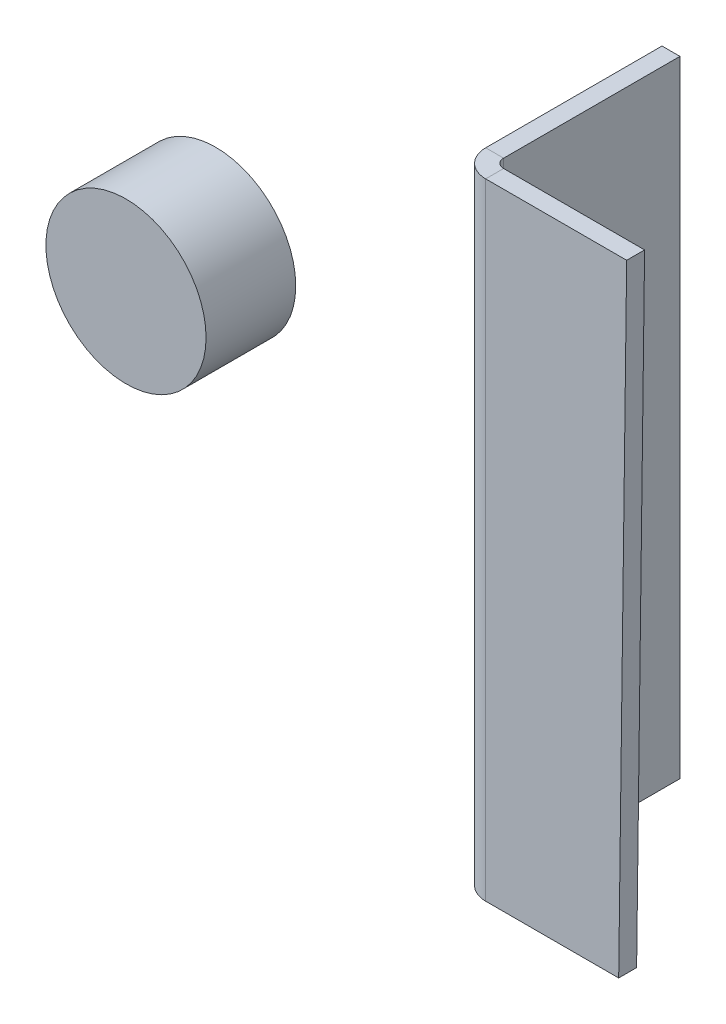
ISO-10303-21;
HEADER;
FILE_DESCRIPTION(('STEP AP214'),'2;1');
FILE_NAME('part.step','',(''),(''),'','','');
FILE_SCHEMA(('AUTOMOTIVE_DESIGN { 1 0 10303 214 1 1 1 1 }'));
ENDSEC;
DATA;
#1=APPLICATION_CONTEXT('core data for automotive mechanical design processes');
#2=APPLICATION_PROTOCOL_DEFINITION('international standard','automotive_design',2000,#1);
#3=PRODUCT_CONTEXT('',#1,'mechanical');
#4=PRODUCT('Part','Part','',(#3));
#5=PRODUCT_RELATED_PRODUCT_CATEGORY('part','',(#4));
#6=PRODUCT_DEFINITION_FORMATION('','',#4);
#7=PRODUCT_DEFINITION_CONTEXT('part definition',#1,'design');
#8=PRODUCT_DEFINITION('design','',#6,#7);
#9=PRODUCT_DEFINITION_SHAPE('','',#8);
#10=(LENGTH_UNIT() NAMED_UNIT(*) SI_UNIT(.MILLI.,.METRE.));
#11=(NAMED_UNIT(*) PLANE_ANGLE_UNIT() SI_UNIT($,.RADIAN.));
#12=(NAMED_UNIT(*) SI_UNIT($,.STERADIAN.) SOLID_ANGLE_UNIT());
#13=UNCERTAINTY_MEASURE_WITH_UNIT(LENGTH_MEASURE(1.E-05),#10,'distance_accuracy_value','');
#14=(GEOMETRIC_REPRESENTATION_CONTEXT(3) GLOBAL_UNCERTAINTY_ASSIGNED_CONTEXT((#13)) GLOBAL_UNIT_ASSIGNED_CONTEXT((#10,
#11,#12)) REPRESENTATION_CONTEXT('',''));
#15=CARTESIAN_POINT('',(0.,0.,0.));
#16=DIRECTION('',(0.,0.,1.));
#17=DIRECTION('',(1.,0.,0.));
#18=AXIS2_PLACEMENT_3D('',#15,#16,#17);
#19=CARTESIAN_POINT('',(0.,-34.3552978489212,-1.));
#20=DIRECTION('',(0.,1.,0.));
#21=DIRECTION('',(0.,0.,1.));
#22=AXIS2_PLACEMENT_3D('',#19,#20,#21);
#23=PLANE('',#22);
#24=DIRECTION('',(1.,0.,0.));
#25=VECTOR('',#24,1.);
#26=CARTESIAN_POINT('',(0.,-34.3552978489212,-1.));
#27=LINE('',#26,#25);
#28=CARTESIAN_POINT('',(-2.,-34.3552978489212,-1.));
#29=VERTEX_POINT('',#28);
#30=CARTESIAN_POINT('',(0.,-34.3552978489212,-1.));
#31=VERTEX_POINT('',#30);
#32=EDGE_CURVE('E14',#29,#31,#27,.T.);
#33=ORIENTED_EDGE('',*,*,#32,.F.);
#34=DIRECTION('',(0.,0.,1.));
#35=VECTOR('',#34,1.);
#36=CARTESIAN_POINT('',(-2.,-34.3552978489212,-20.666570187291));
#37=LINE('',#36,#35);
#38=CARTESIAN_POINT('',(-2.,-34.3552978489212,-20.666570187291));
#39=VERTEX_POINT('',#38);
#40=EDGE_CURVE('E316',#29,#39,#37,.F.);
#41=ORIENTED_EDGE('',*,*,#40,.T.);
#42=DIRECTION('',(1.,0.,0.));
#43=VECTOR('',#42,1.);
#44=CARTESIAN_POINT('',(0.,-34.3552978489212,-20.666570187291));
#45=LINE('',#44,#43);
#46=CARTESIAN_POINT('',(0.,-34.3552978489212,-20.666570187291));
#47=VERTEX_POINT('',#46);
#48=EDGE_CURVE('E103',#39,#47,#45,.T.);
#49=ORIENTED_EDGE('',*,*,#48,.T.);
#50=CARTESIAN_POINT('',(0.,-34.3552978489212,-20.666570187291));
#51=CARTESIAN_POINT('',(0.,-34.3552978489212,-13.777713458194));
#52=CARTESIAN_POINT('',(0.,-34.3552978489212,-6.88885672909699));
#53=CARTESIAN_POINT('',(0.,-34.3552978489212,0.));
#54=B_SPLINE_CURVE_WITH_KNOTS('',3,(#50,#51,#52,#53),.UNSPECIFIED.,.F.,.F.,(4,4),(0.,1.),.UNSPECIFIED.);
#55=EDGE_CURVE('E305',#31,#47,#54,.F.);
#56=ORIENTED_EDGE('',*,*,#55,.F.);
#57=EDGE_LOOP('',(#33,#41,#49,#56));
#58=FACE_BOUND('',#57,.T.);
#59=ADVANCED_FACE('F91',(#58),#23,.F.);
#60=CARTESIAN_POINT('',(0.,0.531267492509077,-20.666570187291));
#61=DIRECTION('',(0.,0.,-1.));
#62=DIRECTION('',(0.,1.,0.));
#63=AXIS2_PLACEMENT_3D('',#60,#61,#62);
#64=PLANE('',#63);
#65=ORIENTED_EDGE('',*,*,#48,.F.);
#66=DIRECTION('',(0.,1.,0.));
#67=VECTOR('',#66,1.);
#68=CARTESIAN_POINT('',(-2.,-34.3552978489212,-20.666570187291));
#69=LINE('',#68,#67);
#70=CARTESIAN_POINT('',(-2.,35.4178328339393,-20.666570187291));
#71=VERTEX_POINT('',#70);
#72=EDGE_CURVE('E313',#39,#71,#69,.T.);
#73=ORIENTED_EDGE('',*,*,#72,.T.);
#74=DIRECTION('',(1.,0.,0.));
#75=VECTOR('',#74,1.);
#76=CARTESIAN_POINT('',(0.,35.4178328339393,-20.666570187291));
#77=LINE('',#76,#75);
#78=CARTESIAN_POINT('',(0.,35.4178328339393,-20.666570187291));
#79=VERTEX_POINT('',#78);
#80=EDGE_CURVE('E415',#71,#79,#77,.T.);
#81=ORIENTED_EDGE('',*,*,#80,.T.);
#82=DIRECTION('',(0.,1.,0.));
#83=VECTOR('',#82,1.);
#84=CARTESIAN_POINT('',(0.,0.531267492509077,-20.666570187291));
#85=LINE('',#84,#83);
#86=EDGE_CURVE('E358',#47,#79,#85,.T.);
#87=ORIENTED_EDGE('',*,*,#86,.F.);
#88=EDGE_LOOP('',(#65,#73,#81,#87));
#89=FACE_BOUND('',#88,.T.);
#90=ADVANCED_FACE('F401',(#89),#64,.T.);
#91=CARTESIAN_POINT('',(0.,35.4178328339393,-20.666570187291));
#92=DIRECTION('',(0.,1.,0.));
#93=DIRECTION('',(0.,0.,1.));
#94=AXIS2_PLACEMENT_3D('',#91,#92,#93);
#95=PLANE('',#94);
#96=ORIENTED_EDGE('',*,*,#80,.F.);
#97=DIRECTION('',(0.,0.,1.));
#98=VECTOR('',#97,1.);
#99=CARTESIAN_POINT('',(-2.,35.4178328339393,-20.666570187291));
#100=LINE('',#99,#98);
#101=CARTESIAN_POINT('',(-2.,35.4178328339393,-1.));
#102=VERTEX_POINT('',#101);
#103=EDGE_CURVE('E318',#71,#102,#100,.T.);
#104=ORIENTED_EDGE('',*,*,#103,.T.);
#105=DIRECTION('',(1.,0.,0.));
#106=VECTOR('',#105,1.);
#107=CARTESIAN_POINT('',(0.,35.4178328339393,-1.));
#108=LINE('',#107,#106);
#109=CARTESIAN_POINT('',(0.,35.4178328339393,-1.));
#110=VERTEX_POINT('',#109);
#111=EDGE_CURVE('E421',#102,#110,#108,.T.);
#112=ORIENTED_EDGE('',*,*,#111,.T.);
#113=CARTESIAN_POINT('',(0.,35.4178328339393,-20.666570187291));
#114=CARTESIAN_POINT('',(0.,35.4178328339393,-13.777713458194));
#115=CARTESIAN_POINT('',(0.,35.4178328339393,-6.88885672909699));
#116=CARTESIAN_POINT('',(0.,35.4178328339393,0.));
#117=B_SPLINE_CURVE_WITH_KNOTS('',3,(#113,#114,#115,#116),.UNSPECIFIED.,.F.,.F.,(4,4),(0.,1.),.UNSPECIFIED.);
#118=EDGE_CURVE('E418',#79,#110,#117,.T.);
#119=ORIENTED_EDGE('',*,*,#118,.F.);
#120=EDGE_LOOP('',(#96,#104,#112,#119));
#121=FACE_BOUND('',#120,.T.);
#122=ADVANCED_FACE('F405',(#121),#95,.T.);
#123=CARTESIAN_POINT('',(1.,35.4178328339393,-1.));
#124=DIRECTION('',(0.,-1.,0.));
#125=DIRECTION('',(1.,0.,0.));
#126=AXIS2_PLACEMENT_3D('',#123,#124,#125);
#127=PLANE('',#126);
#128=ORIENTED_EDGE('',*,*,#111,.F.);
#129=CARTESIAN_POINT('',(1.,35.4178328339393,-1.));
#130=DIRECTION('',(0.,-1.,0.));
#131=DIRECTION('',(0.,0.,-1.));
#132=AXIS2_PLACEMENT_3D('',#129,#130,#131);
#133=CIRCLE('',#132,3.);
#134=CARTESIAN_POINT('',(1.,35.4178328339393,2.));
#135=VERTEX_POINT('',#134);
#136=EDGE_CURVE('E182',#102,#135,#133,.F.);
#137=ORIENTED_EDGE('',*,*,#136,.T.);
#138=CARTESIAN_POINT('',(1.,35.4178328339393,0.));
#139=CARTESIAN_POINT('',(1.,35.4178328339393,2.));
#140=B_SPLINE_CURVE_WITH_KNOTS('',1,(#138,#139),.UNSPECIFIED.,.F.,.F.,(2,2),(0.,1.),.UNSPECIFIED.);
#141=CARTESIAN_POINT('',(1.,35.4178328339393,0.));
#142=VERTEX_POINT('',#141);
#143=EDGE_CURVE('E112',#135,#142,#140,.F.);
#144=ORIENTED_EDGE('',*,*,#143,.T.);
#145=CARTESIAN_POINT('',(1.,35.4178328339393,-1.));
#146=DIRECTION('',(0.,1.,0.));
#147=DIRECTION('',(-1.,0.,0.));
#148=AXIS2_PLACEMENT_3D('',#145,#146,#147);
#149=CIRCLE('',#148,1.);
#150=EDGE_CURVE('E356',#110,#142,#149,.T.);
#151=ORIENTED_EDGE('',*,*,#150,.F.);
#152=EDGE_LOOP('',(#128,#137,#144,#151));
#153=FACE_BOUND('',#152,.T.);
#154=ADVANCED_FACE('F256',(#153),#127,.F.);
#155=CARTESIAN_POINT('',(1.,35.4178328339393,2.));
#156=CARTESIAN_POINT('',(6.24134149667438,35.4178328339393,2.));
#157=CARTESIAN_POINT('',(11.4826829933488,35.4178328339393,2.));
#158=CARTESIAN_POINT('',(16.7240244900232,35.4178328339393,2.));
#159=CARTESIAN_POINT('',(1.,35.4178328339393,0.));
#160=CARTESIAN_POINT('',(6.24134149667438,35.4178328339393,0.));
#161=CARTESIAN_POINT('',(11.4826829933488,35.4178328339393,0.));
#162=CARTESIAN_POINT('',(16.7240244900232,35.4178328339393,0.));
#163=B_SPLINE_SURFACE_WITH_KNOTS('',1,3,((#155,#156,#157,#158),(#159,#160,#161,#162)),
.UNSPECIFIED.,.F.,.F.,.F.,(2,2),(4,4),(0.,1.),(0.0597942200214162,1.),.UNSPECIFIED.);
#164=CARTESIAN_POINT('',(1.,35.4178328339393,2.));
#165=CARTESIAN_POINT('',(6.24134149667438,35.4178328339393,2.));
#166=CARTESIAN_POINT('',(11.4826829933488,35.4178328339393,2.));
#167=CARTESIAN_POINT('',(16.7240244900232,35.4178328339393,2.));
#168=B_SPLINE_CURVE_WITH_KNOTS('',3,(#164,#165,#166,#167),.UNSPECIFIED.,.F.,.F.,(4,4),
(0.0597942200214162,1.),.UNSPECIFIED.);
#169=CARTESIAN_POINT('',(16.7240244900232,35.4178328339393,2.));
#170=VERTEX_POINT('',#169);
#171=EDGE_CURVE('E173',#170,#135,#168,.F.);
#172=CARTESIAN_POINT('',(16.7240244900232,35.4178328339393,2.));
#173=CARTESIAN_POINT('',(16.7240244900232,35.4178328339393,0.));
#174=B_SPLINE_CURVE_WITH_KNOTS('',1,(#172,#173),.UNSPECIFIED.,.F.,.F.,(2,2),(0.,1.),.UNSPECIFIED.);
#175=CARTESIAN_POINT('',(16.7240244900232,35.4178328339393,0.));
#176=VERTEX_POINT('',#175);
#177=EDGE_CURVE('E240',#170,#176,#174,.T.);
#178=CARTESIAN_POINT('',(16.7240244900232,35.4178328339393,0.));
#179=CARTESIAN_POINT('',(11.4826829933488,35.4178328339393,0.));
#180=CARTESIAN_POINT('',(6.24134149667438,35.4178328339393,0.));
#181=CARTESIAN_POINT('',(1.,35.4178328339393,0.));
#182=B_SPLINE_CURVE_WITH_KNOTS('',3,(#178,#179,#180,#181),.UNSPECIFIED.,.F.,.F.,(4,4),
(0.0597942200214163,1.),.UNSPECIFIED.);
#183=EDGE_CURVE('E303',#176,#142,#182,.T.);
#184=ORIENTED_EDGE('',*,*,#143,.F.);
#185=ORIENTED_EDGE('',*,*,#171,.F.);
#186=ORIENTED_EDGE('',*,*,#177,.T.);
#187=ORIENTED_EDGE('',*,*,#183,.T.);
#188=EDGE_LOOP('',(#184,#185,#186,#187));
#189=FACE_BOUND('',#188,.T.);
#190=ADVANCED_FACE('F245',(#189),#163,.F.);
#191=CARTESIAN_POINT('',(16.7240244900232,35.4178328339393,2.));
#192=CARTESIAN_POINT('',(16.4272737386159,12.1601226063192,2.));
#193=CARTESIAN_POINT('',(16.1305229872086,-11.097587621301,2.));
#194=CARTESIAN_POINT('',(15.8337722358014,-34.3552978489212,2.));
#195=CARTESIAN_POINT('',(16.7240244900232,35.4178328339393,0.));
#196=CARTESIAN_POINT('',(16.4272737386159,12.1601226063192,0.));
#197=CARTESIAN_POINT('',(16.1305229872086,-11.097587621301,0.));
#198=CARTESIAN_POINT('',(15.8337722358014,-34.3552978489212,0.));
#199=B_SPLINE_SURFACE_WITH_KNOTS('',1,3,((#191,#192,#193,#194),(#195,#196,#197,#198)),
.UNSPECIFIED.,.F.,.F.,.F.,(2,2),(4,4),(0.,1.),(0.,1.),.UNSPECIFIED.);
#200=CARTESIAN_POINT('',(16.7240244900232,35.4178328339393,2.));
#201=CARTESIAN_POINT('',(16.4272737386159,12.1601226063192,2.));
#202=CARTESIAN_POINT('',(16.1305229872086,-11.097587621301,2.));
#203=CARTESIAN_POINT('',(15.8337722358014,-34.3552978489212,2.));
#204=B_SPLINE_CURVE_WITH_KNOTS('',3,(#200,#201,#202,#203),.UNSPECIFIED.,.F.,.F.,(4,4),(0.,1.),.UNSPECIFIED.);
#205=CARTESIAN_POINT('',(15.8337722358014,-34.3552978489212,2.));
#206=VERTEX_POINT('',#205);
#207=EDGE_CURVE('E188',#206,#170,#204,.F.);
#208=CARTESIAN_POINT('',(15.8337722358014,-34.3552978489212,2.));
#209=CARTESIAN_POINT('',(15.8337722358014,-34.3552978489212,0.));
#210=B_SPLINE_CURVE_WITH_KNOTS('',1,(#208,#209),.UNSPECIFIED.,.F.,.F.,(2,2),(0.,1.),.UNSPECIFIED.);
#211=CARTESIAN_POINT('',(15.8337722358014,-34.3552978489212,0.));
#212=VERTEX_POINT('',#211);
#213=EDGE_CURVE('E159',#206,#212,#210,.T.);
#214=CARTESIAN_POINT('',(15.8337722358014,-34.3552978489212,0.));
#215=CARTESIAN_POINT('',(16.1305229872086,-11.097587621301,0.));
#216=CARTESIAN_POINT('',(16.4272737386159,12.1601226063192,0.));
#217=CARTESIAN_POINT('',(16.7240244900232,35.4178328339393,0.));
#218=B_SPLINE_CURVE_WITH_KNOTS('',3,(#214,#215,#216,#217),.UNSPECIFIED.,.F.,.F.,(4,4),(0.,1.),.UNSPECIFIED.);
#219=EDGE_CURVE('E292',#212,#176,#218,.T.);
#220=ORIENTED_EDGE('',*,*,#177,.F.);
#221=ORIENTED_EDGE('',*,*,#207,.F.);
#222=ORIENTED_EDGE('',*,*,#213,.T.);
#223=ORIENTED_EDGE('',*,*,#219,.T.);
#224=EDGE_LOOP('',(#220,#221,#222,#223));
#225=FACE_BOUND('',#224,.T.);
#226=ADVANCED_FACE('F211',(#225),#199,.F.);
#227=CARTESIAN_POINT('',(15.8337722358014,-34.3552978489212,2.));
#228=CARTESIAN_POINT('',(10.8891814905343,-34.3552978489212,2.));
#229=CARTESIAN_POINT('',(5.94459074526714,-34.3552978489212,2.));
#230=CARTESIAN_POINT('',(0.999999999999994,-34.3552978489212,2.));
#231=CARTESIAN_POINT('',(15.8337722358014,-34.3552978489212,0.));
#232=CARTESIAN_POINT('',(10.8891814905343,-34.3552978489212,0.));
#233=CARTESIAN_POINT('',(5.94459074526714,-34.3552978489212,0.));
#234=CARTESIAN_POINT('',(0.999999999999994,-34.3552978489212,0.));
#235=B_SPLINE_SURFACE_WITH_KNOTS('',1,3,((#227,#228,#229,#230),(#231,#232,#233,#234)),
.UNSPECIFIED.,.F.,.F.,.F.,(2,2),(4,4),(0.,1.),(0.,0.936843855961316),.UNSPECIFIED.);
#236=CARTESIAN_POINT('',(15.8337722358014,-34.3552978489212,2.));
#237=CARTESIAN_POINT('',(10.8891814905343,-34.3552978489212,2.));
#238=CARTESIAN_POINT('',(5.94459074526714,-34.3552978489212,2.));
#239=CARTESIAN_POINT('',(0.999999999999994,-34.3552978489212,2.));
#240=B_SPLINE_CURVE_WITH_KNOTS('',3,(#236,#237,#238,#239),.UNSPECIFIED.,.F.,.F.,(4,4),(0.,
0.936843855961316),.UNSPECIFIED.);
#241=CARTESIAN_POINT('',(0.999999999999994,-34.3552978489212,2.));
#242=VERTEX_POINT('',#241);
#243=EDGE_CURVE('E169',#242,#206,#240,.F.);
#244=CARTESIAN_POINT('',(0.999999999999994,-34.3552978489212,2.));
#245=CARTESIAN_POINT('',(0.999999999999994,-34.3552978489212,0.));
#246=B_SPLINE_CURVE_WITH_KNOTS('',1,(#244,#245),.UNSPECIFIED.,.F.,.F.,(2,2),(0.,1.),.UNSPECIFIED.);
#247=CARTESIAN_POINT('',(0.999999999999994,-34.3552978489212,0.));
#248=VERTEX_POINT('',#247);
#249=EDGE_CURVE('E147',#242,#248,#246,.T.);
#250=CARTESIAN_POINT('',(0.999999999999994,-34.3552978489212,0.));
#251=CARTESIAN_POINT('',(5.94459074526714,-34.3552978489212,0.));
#252=CARTESIAN_POINT('',(10.8891814905343,-34.3552978489212,0.));
#253=CARTESIAN_POINT('',(15.8337722358014,-34.3552978489212,0.));
#254=B_SPLINE_CURVE_WITH_KNOTS('',3,(#250,#251,#252,#253),.UNSPECIFIED.,.F.,.F.,(4,4),(0.,
0.936843855961316),.UNSPECIFIED.);
#255=EDGE_CURVE('E301',#248,#212,#254,.T.);
#256=ORIENTED_EDGE('',*,*,#213,.F.);
#257=ORIENTED_EDGE('',*,*,#243,.F.);
#258=ORIENTED_EDGE('',*,*,#249,.T.);
#259=ORIENTED_EDGE('',*,*,#255,.T.);
#260=EDGE_LOOP('',(#256,#257,#258,#259));
#261=FACE_BOUND('',#260,.T.);
#262=ADVANCED_FACE('F185',(#261),#235,.F.);
#263=CARTESIAN_POINT('',(1.,-34.3552978489212,-1.));
#264=DIRECTION('',(0.,1.,0.));
#265=DIRECTION('',(-1.,0.,0.));
#266=AXIS2_PLACEMENT_3D('',#263,#264,#265);
#267=PLANE('',#266);
#268=CARTESIAN_POINT('',(1.,-34.3552978489212,-1.));
#269=DIRECTION('',(0.,-1.,0.));
#270=DIRECTION('',(0.,0.,-1.));
#271=AXIS2_PLACEMENT_3D('',#268,#269,#270);
#272=CIRCLE('',#271,3.);
#273=EDGE_CURVE('E150',#242,#29,#272,.T.);
#274=ORIENTED_EDGE('',*,*,#273,.T.);
#275=ORIENTED_EDGE('',*,*,#32,.T.);
#276=CARTESIAN_POINT('',(1.,-34.3552978489212,-1.));
#277=DIRECTION('',(0.,-1.,0.));
#278=DIRECTION('',(1.,0.,0.));
#279=AXIS2_PLACEMENT_3D('',#276,#277,#278);
#280=CIRCLE('',#279,1.);
#281=EDGE_CURVE('E152',#248,#31,#280,.T.);
#282=ORIENTED_EDGE('',*,*,#281,.F.);
#283=ORIENTED_EDGE('',*,*,#249,.F.);
#284=EDGE_LOOP('',(#274,#275,#282,#283));
#285=FACE_BOUND('',#284,.T.);
#286=ADVANCED_FACE('F93',(#285),#267,.F.);
#287=CARTESIAN_POINT('',(15.8337722358014,-34.3552978489212,0.));
#288=DIRECTION('',(0.,0.,1.));
#289=DIRECTION('',(0.012758203460271,0.999918610810133,0.));
#290=AXIS2_PLACEMENT_3D('',#287,#288,#289);
#291=PLANE('',#290);
#292=ORIENTED_EDGE('',*,*,#255,.F.);
#293=DIRECTION('',(0.,-1.,0.));
#294=VECTOR('',#293,1.);
#295=CARTESIAN_POINT('',(1.,-34.3552978489212,0.));
#296=LINE('',#295,#294);
#297=EDGE_CURVE('E160',#248,#142,#296,.F.);
#298=ORIENTED_EDGE('',*,*,#297,.T.);
#299=ORIENTED_EDGE('',*,*,#183,.F.);
#300=ORIENTED_EDGE('',*,*,#219,.F.);
#301=EDGE_LOOP('',(#292,#298,#299,#300));
#302=FACE_BOUND('',#301,.T.);
#303=ADVANCED_FACE('F299',(#302),#291,.F.);
#304=CARTESIAN_POINT('',(0.,-34.3552978489212,-20.666570187291));
#305=DIRECTION('',(1.,0.,0.));
#306=DIRECTION('',(0.,1.,0.));
#307=AXIS2_PLACEMENT_3D('',#304,#305,#306);
#308=PLANE('',#307);
#309=ORIENTED_EDGE('',*,*,#118,.T.);
#310=DIRECTION('',(0.,-1.,0.));
#311=VECTOR('',#310,1.);
#312=CARTESIAN_POINT('',(0.,-34.3552978489212,-1.));
#313=LINE('',#312,#311);
#314=EDGE_CURVE('E364',#110,#31,#313,.T.);
#315=ORIENTED_EDGE('',*,*,#314,.T.);
#316=ORIENTED_EDGE('',*,*,#55,.T.);
#317=ORIENTED_EDGE('',*,*,#86,.T.);
#318=EDGE_LOOP('',(#309,#315,#316,#317));
#319=FACE_BOUND('',#318,.T.);
#320=ADVANCED_FACE('F383',(#319),#308,.T.);
#321=CARTESIAN_POINT('',(1.,-34.3552978489212,-1.));
#322=DIRECTION('',(0.,-1.,0.));
#323=DIRECTION('',(0.,0.,-1.));
#324=AXIS2_PLACEMENT_3D('',#321,#322,#323);
#325=CYLINDRICAL_SURFACE('',#324,1.);
#326=ORIENTED_EDGE('',*,*,#150,.T.);
#327=ORIENTED_EDGE('',*,*,#297,.F.);
#328=ORIENTED_EDGE('',*,*,#281,.T.);
#329=ORIENTED_EDGE('',*,*,#314,.F.);
#330=EDGE_LOOP('',(#326,#327,#328,#329));
#331=FACE_BOUND('',#330,.T.);
#332=ADVANCED_FACE('F336',(#331),#325,.F.);
#333=CARTESIAN_POINT('',(15.8337722358014,-34.3552978489212,2.));
#334=DIRECTION('',(0.,0.,1.));
#335=DIRECTION('',(0.012758203460271,0.999918610810133,0.));
#336=AXIS2_PLACEMENT_3D('',#333,#334,#335);
#337=PLANE('',#336);
#338=ORIENTED_EDGE('',*,*,#243,.T.);
#339=ORIENTED_EDGE('',*,*,#207,.T.);
#340=ORIENTED_EDGE('',*,*,#171,.T.);
#341=DIRECTION('',(0.,-1.,0.));
#342=VECTOR('',#341,1.);
#343=CARTESIAN_POINT('',(1.,-34.3552978489212,2.));
#344=LINE('',#343,#342);
#345=EDGE_CURVE('E166',#242,#135,#344,.F.);
#346=ORIENTED_EDGE('',*,*,#345,.F.);
#347=EDGE_LOOP('',(#338,#339,#340,#346));
#348=FACE_BOUND('',#347,.T.);
#349=ADVANCED_FACE('F167',(#348),#337,.T.);
#350=CARTESIAN_POINT('',(-2.,-34.3552978489212,-20.666570187291));
#351=DIRECTION('',(1.,0.,0.));
#352=DIRECTION('',(0.,1.,0.));
#353=AXIS2_PLACEMENT_3D('',#350,#351,#352);
#354=PLANE('',#353);
#355=ORIENTED_EDGE('',*,*,#103,.F.);
#356=ORIENTED_EDGE('',*,*,#72,.F.);
#357=ORIENTED_EDGE('',*,*,#40,.F.);
#358=DIRECTION('',(0.,1.,0.));
#359=VECTOR('',#358,1.);
#360=CARTESIAN_POINT('',(-2.,-34.3552978489212,-1.));
#361=LINE('',#360,#359);
#362=EDGE_CURVE('E177',#102,#29,#361,.F.);
#363=ORIENTED_EDGE('',*,*,#362,.F.);
#364=EDGE_LOOP('',(#355,#356,#357,#363));
#365=FACE_BOUND('',#364,.T.);
#366=ADVANCED_FACE('F335',(#365),#354,.F.);
#367=CARTESIAN_POINT('',(1.,-34.3552978489212,-1.));
#368=DIRECTION('',(0.,-1.,0.));
#369=DIRECTION('',(0.,0.,-1.));
#370=AXIS2_PLACEMENT_3D('',#367,#368,#369);
#371=CYLINDRICAL_SURFACE('',#370,3.);
#372=ORIENTED_EDGE('',*,*,#136,.F.);
#373=ORIENTED_EDGE('',*,*,#362,.T.);
#374=ORIENTED_EDGE('',*,*,#273,.F.);
#375=ORIENTED_EDGE('',*,*,#345,.T.);
#376=EDGE_LOOP('',(#372,#373,#374,#375));
#377=FACE_BOUND('',#376,.T.);
#378=ADVANCED_FACE('F179',(#377),#371,.T.);
#379=CLOSED_SHELL('',(#59,#90,#122,#154,#190,#226,#262,#286,#303,#320,#332,#349,#366,#378));
#380=MANIFOLD_SOLID_BREP('B2',#379);
#381=CARTESIAN_POINT('',(-31.1181431572353,12.489510245604,10.));
#382=DIRECTION('',(0.,0.,-1.));
#383=DIRECTION('',(-1.,0.,0.));
#384=AXIS2_PLACEMENT_3D('',#381,#382,#383);
#385=CYLINDRICAL_SURFACE('',#384,8.93229322450319);
#386=CARTESIAN_POINT('',(-31.1181431572353,12.489510245604,10.));
#387=DIRECTION('',(0.,0.,1.));
#388=DIRECTION('',(1.,0.,0.));
#389=AXIS2_PLACEMENT_3D('',#386,#387,#388);
#390=CIRCLE('',#389,8.93229322450319);
#391=CARTESIAN_POINT('',(-22.1858499327321,12.489510245604,10.));
#392=VERTEX_POINT('',#391);
#393=EDGE_CURVE('E90',#392,#392,#390,.T.);
#394=ORIENTED_EDGE('',*,*,#393,.F.);
#395=EDGE_LOOP('',(#394));
#396=FACE_BOUND('',#395,.T.);
#397=CARTESIAN_POINT('',(-31.1181431572353,12.489510245604,0.));
#398=DIRECTION('',(0.,0.,1.));
#399=DIRECTION('',(1.,0.,0.));
#400=AXIS2_PLACEMENT_3D('',#397,#398,#399);
#401=CIRCLE('',#400,8.93229322450319);
#402=CARTESIAN_POINT('',(-22.1858499327321,12.489510245604,0.));
#403=VERTEX_POINT('',#402);
#404=EDGE_CURVE('E665',#403,#403,#401,.T.);
#405=ORIENTED_EDGE('',*,*,#404,.T.);
#406=EDGE_LOOP('',(#405));
#407=FACE_BOUND('',#406,.T.);
#408=ADVANCED_FACE('F662',(#396,#407),#385,.T.);
#409=CARTESIAN_POINT('',(-31.1181431572353,12.489510245604,10.));
#410=DIRECTION('',(0.,0.,1.));
#411=DIRECTION('',(1.,0.,0.));
#412=AXIS2_PLACEMENT_3D('',#409,#410,#411);
#413=PLANE('',#412);
#414=ORIENTED_EDGE('',*,*,#393,.T.);
#415=EDGE_LOOP('',(#414));
#416=FACE_BOUND('',#415,.T.);
#417=ADVANCED_FACE('F677',(#416),#413,.T.);
#418=CARTESIAN_POINT('',(-31.1181431572353,12.489510245604,0.));
#419=DIRECTION('',(0.,0.,1.));
#420=DIRECTION('',(1.,0.,0.));
#421=AXIS2_PLACEMENT_3D('',#418,#419,#420);
#422=PLANE('',#421);
#423=ORIENTED_EDGE('',*,*,#404,.F.);
#424=EDGE_LOOP('',(#423));
#425=FACE_BOUND('',#424,.T.);
#426=ADVANCED_FACE('F675',(#425),#422,.F.);
#427=CLOSED_SHELL('',(#408,#417,#426));
#428=MANIFOLD_SOLID_BREP('B8',#427);
#429=ADVANCED_BREP_SHAPE_REPRESENTATION('',(#18,#380,#428),#14);
#430=SHAPE_DEFINITION_REPRESENTATION(#9,#429);
ENDSEC;
END-ISO-10303-21;
